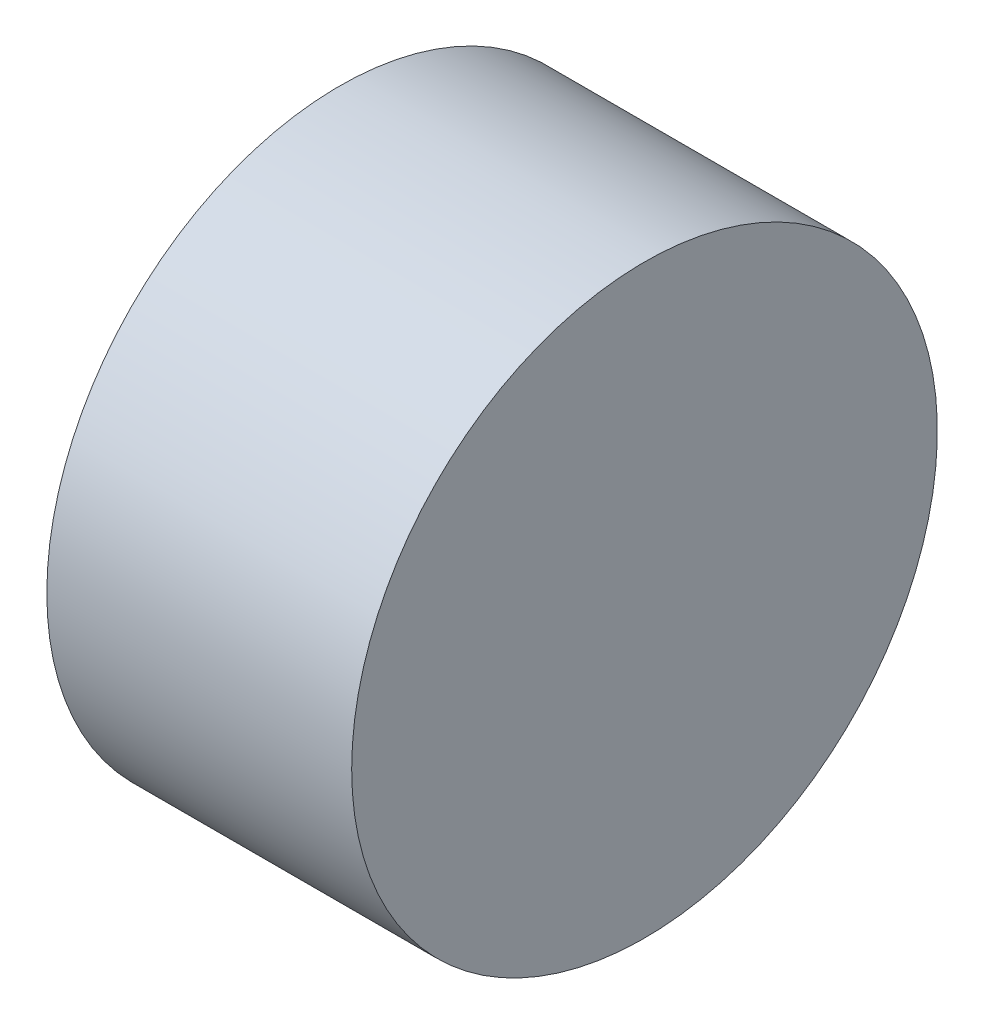
ISO-10303-21;
HEADER;
FILE_DESCRIPTION(('STEP AP214'),'2;1');
FILE_NAME('part.step','',(''),(''),'','','');
FILE_SCHEMA(('AUTOMOTIVE_DESIGN { 1 0 10303 214 1 1 1 1 }'));
ENDSEC;
DATA;
#1=APPLICATION_CONTEXT('core data for automotive mechanical design processes');
#2=APPLICATION_PROTOCOL_DEFINITION('international standard','automotive_design',2000,#1);
#3=PRODUCT_CONTEXT('',#1,'mechanical');
#4=PRODUCT('Part','Part','',(#3));
#5=PRODUCT_RELATED_PRODUCT_CATEGORY('part','',(#4));
#6=PRODUCT_DEFINITION_FORMATION('','',#4);
#7=PRODUCT_DEFINITION_CONTEXT('part definition',#1,'design');
#8=PRODUCT_DEFINITION('design','',#6,#7);
#9=PRODUCT_DEFINITION_SHAPE('','',#8);
#10=(LENGTH_UNIT() NAMED_UNIT(*) SI_UNIT(.MILLI.,.METRE.));
#11=(NAMED_UNIT(*) PLANE_ANGLE_UNIT() SI_UNIT($,.RADIAN.));
#12=(NAMED_UNIT(*) SI_UNIT($,.STERADIAN.) SOLID_ANGLE_UNIT());
#13=UNCERTAINTY_MEASURE_WITH_UNIT(LENGTH_MEASURE(1.E-05),#10,'distance_accuracy_value','');
#14=(GEOMETRIC_REPRESENTATION_CONTEXT(3) GLOBAL_UNCERTAINTY_ASSIGNED_CONTEXT((#13)) GLOBAL_UNIT_ASSIGNED_CONTEXT((#10,
#11,#12)) REPRESENTATION_CONTEXT('',''));
#15=CARTESIAN_POINT('',(0.,0.,0.));
#16=DIRECTION('',(0.,0.,1.));
#17=DIRECTION('',(1.,0.,0.));
#18=AXIS2_PLACEMENT_3D('',#15,#16,#17);
#19=CARTESIAN_POINT('',(0.,0.,-12.2000000000035));
#20=DIRECTION('',(-1.,0.,0.));
#21=DIRECTION('',(0.,0.,1.));
#22=AXIS2_PLACEMENT_3D('',#19,#20,#21);
#23=PLANE('',#22);
#24=CARTESIAN_POINT('',(0.,0.,0.));
#25=DIRECTION('',(-1.,0.,0.));
#26=DIRECTION('',(0.,0.,1.));
#27=AXIS2_PLACEMENT_3D('',#24,#25,#26);
#28=CIRCLE('',#27,12.2000000000035);
#29=CARTESIAN_POINT('',(0.,0.,12.2000000000035));
#30=VERTEX_POINT('',#29);
#31=EDGE_CURVE('E222',#30,#30,#28,.T.);
#32=ORIENTED_EDGE('',*,*,#31,.F.);
#33=EDGE_LOOP('',(#32));
#34=FACE_BOUND('',#33,.T.);
#35=ADVANCED_FACE('F36',(#34),#23,.F.);
#36=CARTESIAN_POINT('',(-16.7,0.,0.));
#37=DIRECTION('',(1.,0.,0.));
#38=DIRECTION('',(0.,0.,-1.));
#39=AXIS2_PLACEMENT_3D('',#36,#37,#38);
#40=PLANE('',#39);
#41=CARTESIAN_POINT('',(-16.7,0.,0.));
#42=DIRECTION('',(-1.,0.,0.));
#43=DIRECTION('',(0.,0.,1.));
#44=AXIS2_PLACEMENT_3D('',#41,#42,#43);
#45=CIRCLE('',#44,3.);
#46=CARTESIAN_POINT('',(-16.7,0.,3.));
#47=VERTEX_POINT('',#46);
#48=EDGE_CURVE('E11',#47,#47,#45,.T.);
#49=ORIENTED_EDGE('',*,*,#48,.T.);
#50=EDGE_LOOP('',(#49));
#51=FACE_BOUND('',#50,.T.);
#52=ADVANCED_FACE('F253',(#51),#40,.F.);
#53=CARTESIAN_POINT('',(-159.613189405079,0.,0.));
#54=DIRECTION('',(-1.,0.,0.));
#55=DIRECTION('',(0.,0.,1.));
#56=AXIS2_PLACEMENT_3D('',#53,#54,#55);
#57=CYLINDRICAL_SURFACE('',#56,3.);
#58=ORIENTED_EDGE('',*,*,#48,.F.);
#59=EDGE_LOOP('',(#58));
#60=FACE_BOUND('',#59,.T.);
#61=CARTESIAN_POINT('',(-12.7,0.,0.));
#62=DIRECTION('',(-1.,0.,0.));
#63=DIRECTION('',(0.,0.,1.));
#64=AXIS2_PLACEMENT_3D('',#61,#62,#63);
#65=CIRCLE('',#64,3.);
#66=CARTESIAN_POINT('',(-12.7,0.,3.));
#67=VERTEX_POINT('',#66);
#68=EDGE_CURVE('E43',#67,#67,#65,.T.);
#69=ORIENTED_EDGE('',*,*,#68,.T.);
#70=EDGE_LOOP('',(#69));
#71=FACE_BOUND('',#70,.T.);
#72=ADVANCED_FACE('F236',(#60,#71),#57,.T.);
#73=CARTESIAN_POINT('',(-12.7,0.,-3.));
#74=DIRECTION('',(1.,0.,0.));
#75=DIRECTION('',(0.,0.,-1.));
#76=AXIS2_PLACEMENT_3D('',#73,#74,#75);
#77=PLANE('',#76);
#78=CARTESIAN_POINT('',(-12.7,-5.0835038482262,0.));
#79=DIRECTION('',(-1.,0.,0.));
#80=DIRECTION('',(0.,0.,1.));
#81=AXIS2_PLACEMENT_3D('',#78,#79,#80);
#82=CIRCLE('',#81,0.65);
#83=CARTESIAN_POINT('',(-12.7,-5.0835038482262,0.649999999999983));
#84=VERTEX_POINT('',#83);
#85=EDGE_CURVE('E385',#84,#84,#82,.T.);
#86=ORIENTED_EDGE('',*,*,#85,.F.);
#87=EDGE_LOOP('',(#86));
#88=FACE_BOUND('',#87,.T.);
#89=CARTESIAN_POINT('',(-12.7,5.0835038482262,0.));
#90=DIRECTION('',(-1.,0.,0.));
#91=DIRECTION('',(0.,0.,1.));
#92=AXIS2_PLACEMENT_3D('',#89,#90,#91);
#93=CIRCLE('',#92,0.65);
#94=CARTESIAN_POINT('',(-12.7,5.0835038482262,0.649999999999982));
#95=VERTEX_POINT('',#94);
#96=EDGE_CURVE('E384',#95,#95,#93,.T.);
#97=ORIENTED_EDGE('',*,*,#96,.F.);
#98=EDGE_LOOP('',(#97));
#99=FACE_BOUND('',#98,.T.);
#100=CARTESIAN_POINT('',(-12.7,-7.57819435489836,-4.85499436862564));
#101=DIRECTION('',(-1.,0.,0.));
#102=DIRECTION('',(0.,0.,1.));
#103=AXIS2_PLACEMENT_3D('',#100,#101,#102);
#104=CIRCLE('',#103,0.75);
#105=CARTESIAN_POINT('',(-12.7,-7.57819435489836,-4.10499436862564));
#106=VERTEX_POINT('',#105);
#107=EDGE_CURVE('E394',#106,#106,#104,.T.);
#108=ORIENTED_EDGE('',*,*,#107,.F.);
#109=EDGE_LOOP('',(#108));
#110=FACE_BOUND('',#109,.T.);
#111=CARTESIAN_POINT('',(-12.7,-5.16494921499982,-3.30894117764878));
#112=DIRECTION('',(-1.,0.,0.));
#113=DIRECTION('',(0.,0.,1.));
#114=AXIS2_PLACEMENT_3D('',#111,#112,#113);
#115=CIRCLE('',#114,0.749999999999998);
#116=CARTESIAN_POINT('',(-12.7,-5.16494921499982,-2.55894117764878));
#117=VERTEX_POINT('',#116);
#118=EDGE_CURVE('E406',#117,#117,#115,.T.);
#119=ORIENTED_EDGE('',*,*,#118,.F.);
#120=EDGE_LOOP('',(#119));
#121=FACE_BOUND('',#120,.T.);
#122=CARTESIAN_POINT('',(-12.7,-0.415451281010973,8.99040601047063));
#123=DIRECTION('',(-1.,0.,0.));
#124=DIRECTION('',(0.,0.,1.));
#125=AXIS2_PLACEMENT_3D('',#122,#123,#124);
#126=CIRCLE('',#125,0.75);
#127=CARTESIAN_POINT('',(-12.7,-0.415451281010973,9.74040601047063));
#128=VERTEX_POINT('',#127);
#129=EDGE_CURVE('E400',#128,#128,#126,.T.);
#130=ORIENTED_EDGE('',*,*,#129,.F.);
#131=EDGE_LOOP('',(#130));
#132=FACE_BOUND('',#131,.T.);
#133=CARTESIAN_POINT('',(-12.7,-0.283152511972302,6.12744781827073));
#134=DIRECTION('',(-1.,0.,0.));
#135=DIRECTION('',(0.,0.,1.));
#136=AXIS2_PLACEMENT_3D('',#133,#134,#135);
#137=CIRCLE('',#136,0.75);
#138=CARTESIAN_POINT('',(-12.7,-0.283152511972302,6.87744781827073));
#139=VERTEX_POINT('',#138);
#140=EDGE_CURVE('E399',#139,#139,#137,.T.);
#141=ORIENTED_EDGE('',*,*,#140,.F.);
#142=EDGE_LOOP('',(#141));
#143=FACE_BOUND('',#142,.T.);
#144=CARTESIAN_POINT('',(-12.7,7.99364563590934,-4.13541164184506));
#145=DIRECTION('',(-1.,0.,0.));
#146=DIRECTION('',(0.,0.,1.));
#147=AXIS2_PLACEMENT_3D('',#144,#145,#146);
#148=CIRCLE('',#147,0.75);
#149=CARTESIAN_POINT('',(-12.7,7.99364563590934,-3.38541164184506));
#150=VERTEX_POINT('',#149);
#151=EDGE_CURVE('E417',#150,#150,#148,.T.);
#152=ORIENTED_EDGE('',*,*,#151,.F.);
#153=EDGE_LOOP('',(#152));
#154=FACE_BOUND('',#153,.T.);
#155=CARTESIAN_POINT('',(-12.7,5.44810172697213,-2.818506640622));
#156=DIRECTION('',(-1.,0.,0.));
#157=DIRECTION('',(0.,0.,1.));
#158=AXIS2_PLACEMENT_3D('',#155,#156,#157);
#159=CIRCLE('',#158,0.749999999999998);
#160=CARTESIAN_POINT('',(-12.7,5.44810172697213,-2.068506640622));
#161=VERTEX_POINT('',#160);
#162=EDGE_CURVE('E150',#161,#161,#159,.T.);
#163=ORIENTED_EDGE('',*,*,#162,.F.);
#164=EDGE_LOOP('',(#163));
#165=FACE_BOUND('',#164,.T.);
#166=CARTESIAN_POINT('',(-12.7,0.,0.));
#167=DIRECTION('',(-1.,0.,0.));
#168=DIRECTION('',(0.,0.,1.));
#169=AXIS2_PLACEMENT_3D('',#166,#167,#168);
#170=CIRCLE('',#169,11.);
#171=CARTESIAN_POINT('',(-12.7,7.69478931895491,7.86067537409461));
#172=VERTEX_POINT('',#171);
#173=CARTESIAN_POINT('',(-12.7,10.357432093874,3.70453781473321));
#174=VERTEX_POINT('',#173);
#175=EDGE_CURVE('E156',#172,#174,#170,.T.);
#176=ORIENTED_EDGE('',*,*,#175,.F.);
#177=CARTESIAN_POINT('',(-12.7,7.70986986942216,6.44654222018102));
#178=DIRECTION('',(-1.,0.,0.));
#179=DIRECTION('',(0.,0.,1.));
#180=AXIS2_PLACEMENT_3D('',#177,#178,#179);
#181=CIRCLE('',#180,1.41421356237309);
#182=CARTESIAN_POINT('',(-12.7,6.29573671550856,6.43146166971377));
#183=VERTEX_POINT('',#182);
#184=EDGE_CURVE('E50',#183,#172,#181,.T.);
#185=ORIENTED_EDGE('',*,*,#184,.F.);
#186=CARTESIAN_POINT('',(-12.7,0.,0.));
#187=DIRECTION('',(1.,0.,0.));
#188=DIRECTION('',(0.,0.,1.));
#189=AXIS2_PLACEMENT_3D('',#186,#187,#188);
#190=CIRCLE('',#189,9.);
#191=CARTESIAN_POINT('',(-12.7,8.47426262226057,3.03098548478172));
#192=VERTEX_POINT('',#191);
#193=EDGE_CURVE('E144',#192,#183,#190,.T.);
#194=ORIENTED_EDGE('',*,*,#193,.F.);
#195=CARTESIAN_POINT('',(-12.7,9.07907119309155,4.3093463855642));
#196=DIRECTION('',(-1.,0.,0.));
#197=DIRECTION('',(0.,0.,-1.));
#198=AXIS2_PLACEMENT_3D('',#195,#196,#197);
#199=CIRCLE('',#198,1.4142135623731);
#200=EDGE_CURVE('E147',#174,#192,#199,.T.);
#201=ORIENTED_EDGE('',*,*,#200,.F.);
#202=EDGE_LOOP('',(#176,#185,#194,#201));
#203=FACE_BOUND('',#202,.T.);
#204=CARTESIAN_POINT('',(-12.7,0.,0.));
#205=DIRECTION('',(-1.,0.,0.));
#206=DIRECTION('',(0.,0.,1.));
#207=AXIS2_PLACEMENT_3D('',#204,#205,#206);
#208=CIRCLE('',#207,11.);
#209=CARTESIAN_POINT('',(-12.7,-10.6549392243461,2.73354533993676));
#210=VERTEX_POINT('',#209);
#211=CARTESIAN_POINT('',(-12.7,-8.3869399037761,7.11753040390052));
#212=VERTEX_POINT('',#211);
#213=EDGE_CURVE('E182',#210,#212,#208,.T.);
#214=ORIENTED_EDGE('',*,*,#213,.F.);
#215=CARTESIAN_POINT('',(-12.7,-9.43780426395679,3.45367205670125));
#216=DIRECTION('',(-1.,0.,0.));
#217=DIRECTION('',(0.,0.,1.));
#218=AXIS2_PLACEMENT_3D('',#215,#216,#217);
#219=CIRCLE('',#218,1.4142135623731);
#220=CARTESIAN_POINT('',(-12.7,-8.7176775471923,2.2365370963119));
#221=VERTEX_POINT('',#220);
#222=EDGE_CURVE('E58',#221,#210,#219,.T.);
#223=ORIENTED_EDGE('',*,*,#222,.F.);
#224=CARTESIAN_POINT('',(-12.7,0.,0.));
#225=DIRECTION('',(1.,0.,0.));
#226=DIRECTION('',(0.,0.,1.));
#227=AXIS2_PLACEMENT_3D('',#224,#225,#226);
#228=CIRCLE('',#227,9.);
#229=CARTESIAN_POINT('',(-12.7,-6.86204173945317,5.82343396682769));
#230=VERTEX_POINT('',#229);
#231=EDGE_CURVE('E171',#230,#221,#228,.T.);
#232=ORIENTED_EDGE('',*,*,#231,.F.);
#233=CARTESIAN_POINT('',(-12.7,-8.27153904015104,5.70803310320264));
#234=DIRECTION('',(-1.,0.,0.));
#235=DIRECTION('',(0.,0.,-1.));
#236=AXIS2_PLACEMENT_3D('',#233,#234,#235);
#237=CIRCLE('',#236,1.4142135623731);
#238=EDGE_CURVE('E186',#212,#230,#237,.T.);
#239=ORIENTED_EDGE('',*,*,#238,.F.);
#240=EDGE_LOOP('',(#214,#223,#232,#239));
#241=FACE_BOUND('',#240,.T.);
#242=CARTESIAN_POINT('',(-12.7,0.,0.));
#243=DIRECTION('',(-1.,0.,0.));
#244=DIRECTION('',(0.,0.,1.));
#245=AXIS2_PLACEMENT_3D('',#242,#243,#244);
#246=CIRCLE('',#245,11.);
#247=CARTESIAN_POINT('',(-12.7,2.96014990539117,-10.5942207140314));
#248=VERTEX_POINT('',#247);
#249=CARTESIAN_POINT('',(-12.7,-1.97049219009802,-10.8220682186338));
#250=VERTEX_POINT('',#249);
#251=EDGE_CURVE('E212',#248,#250,#246,.T.);
#252=ORIENTED_EDGE('',*,*,#251,.F.);
#253=CARTESIAN_POINT('',(-12.7,1.72793439453457,-9.90021427688231));
#254=DIRECTION('',(-1.,0.,0.));
#255=DIRECTION('',(0.,0.,1.));
#256=AXIS2_PLACEMENT_3D('',#253,#254,#255);
#257=CIRCLE('',#256,1.41421356237309);
#258=CARTESIAN_POINT('',(-12.7,2.42194083168369,-8.66799876602571));
#259=VERTEX_POINT('',#258);
#260=EDGE_CURVE('E163',#259,#248,#257,.T.);
#261=ORIENTED_EDGE('',*,*,#260,.F.);
#262=CARTESIAN_POINT('',(-12.7,0.,0.));
#263=DIRECTION('',(1.,0.,0.));
#264=DIRECTION('',(0.,0.,1.));
#265=AXIS2_PLACEMENT_3D('',#262,#263,#264);
#266=CIRCLE('',#265,9.);
#267=CARTESIAN_POINT('',(-12.7,-1.61222088280747,-8.85441945160943));
#268=VERTEX_POINT('',#267);
#269=EDGE_CURVE('E201',#268,#259,#266,.T.);
#270=ORIENTED_EDGE('',*,*,#269,.F.);
#271=CARTESIAN_POINT('',(-12.7,-0.807532152940578,-10.0173794887669));
#272=DIRECTION('',(-1.,0.,0.));
#273=DIRECTION('',(0.,0.,-1.));
#274=AXIS2_PLACEMENT_3D('',#271,#272,#273);
#275=CIRCLE('',#274,1.4142135623731);
#276=EDGE_CURVE('E215',#250,#268,#275,.T.);
#277=ORIENTED_EDGE('',*,*,#276,.F.);
#278=EDGE_LOOP('',(#252,#261,#270,#277));
#279=FACE_BOUND('',#278,.T.);
#280=ORIENTED_EDGE('',*,*,#68,.F.);
#281=EDGE_LOOP('',(#280));
#282=FACE_BOUND('',#281,.T.);
#283=CARTESIAN_POINT('',(-12.7,0.,0.));
#284=DIRECTION('',(-1.,0.,0.));
#285=DIRECTION('',(0.,0.,1.));
#286=AXIS2_PLACEMENT_3D('',#283,#284,#285);
#287=CIRCLE('',#286,12.2);
#288=CARTESIAN_POINT('',(-12.7,0.,12.2));
#289=VERTEX_POINT('',#288);
#290=EDGE_CURVE('E231',#289,#289,#287,.T.);
#291=ORIENTED_EDGE('',*,*,#290,.T.);
#292=EDGE_LOOP('',(#291));
#293=FACE_BOUND('',#292,.T.);
#294=ADVANCED_FACE('F238',(#88,#99,#110,#121,#132,#143,#154,#165,#203,#241,#279,#282,#293),#77,.F.);
#295=CARTESIAN_POINT('',(-159.613189405079,0.,0.));
#296=DIRECTION('',(-1.,0.,0.));
#297=DIRECTION('',(0.,0.,1.));
#298=AXIS2_PLACEMENT_3D('',#295,#296,#297);
#299=CYLINDRICAL_SURFACE('',#298,12.2000000000018);
#300=ORIENTED_EDGE('',*,*,#290,.F.);
#301=EDGE_LOOP('',(#300));
#302=FACE_BOUND('',#301,.T.);
#303=ORIENTED_EDGE('',*,*,#31,.T.);
#304=EDGE_LOOP('',(#303));
#305=FACE_BOUND('',#304,.T.);
#306=ADVANCED_FACE('F241',(#302,#305),#299,.T.);
#307=CARTESIAN_POINT('',(-9.7,1.72793439453457,-9.90021427688231));
#308=DIRECTION('',(-1.,0.,0.));
#309=DIRECTION('',(0.,0.,1.));
#310=AXIS2_PLACEMENT_3D('',#307,#308,#309);
#311=CYLINDRICAL_SURFACE('',#310,1.41421356237309);
#312=ORIENTED_EDGE('',*,*,#260,.T.);
#313=DIRECTION('',(-1.,0.,0.));
#314=VECTOR('',#313,1.);
#315=CARTESIAN_POINT('',(-9.7,2.96014990539117,-10.5942207140314));
#316=LINE('',#315,#314);
#317=CARTESIAN_POINT('',(-9.7,2.96014990539117,-10.5942207140314));
#318=VERTEX_POINT('',#317);
#319=EDGE_CURVE('E210',#318,#248,#316,.T.);
#320=ORIENTED_EDGE('',*,*,#319,.F.);
#321=CARTESIAN_POINT('',(-9.7,1.72793439453457,-9.90021427688231));
#322=DIRECTION('',(-1.,0.,0.));
#323=DIRECTION('',(0.,0.,1.));
#324=AXIS2_PLACEMENT_3D('',#321,#322,#323);
#325=CIRCLE('',#324,1.41421356237309);
#326=CARTESIAN_POINT('',(-9.7,2.42194083168369,-8.66799876602571));
#327=VERTEX_POINT('',#326);
#328=EDGE_CURVE('E197',#327,#318,#325,.T.);
#329=ORIENTED_EDGE('',*,*,#328,.F.);
#330=DIRECTION('',(-1.,0.,0.));
#331=VECTOR('',#330,1.);
#332=CARTESIAN_POINT('',(-9.7,2.42194083168369,-8.66799876602571));
#333=LINE('',#332,#331);
#334=EDGE_CURVE('E220',#327,#259,#333,.T.);
#335=ORIENTED_EDGE('',*,*,#334,.T.);
#336=EDGE_LOOP('',(#312,#320,#329,#335));
#337=FACE_BOUND('',#336,.T.);
#338=ADVANCED_FACE('F248',(#337),#311,.F.);
#339=CARTESIAN_POINT('',(-9.7,0.,0.));
#340=DIRECTION('',(-1.,0.,0.));
#341=DIRECTION('',(0.,0.,1.));
#342=AXIS2_PLACEMENT_3D('',#339,#340,#341);
#343=CYLINDRICAL_SURFACE('',#342,9.);
#344=ORIENTED_EDGE('',*,*,#269,.T.);
#345=ORIENTED_EDGE('',*,*,#334,.F.);
#346=CARTESIAN_POINT('',(-9.7,0.,0.));
#347=DIRECTION('',(1.,0.,0.));
#348=DIRECTION('',(0.,0.,1.));
#349=AXIS2_PLACEMENT_3D('',#346,#347,#348);
#350=CIRCLE('',#349,9.);
#351=CARTESIAN_POINT('',(-9.7,-1.61222088280747,-8.85441945160943));
#352=VERTEX_POINT('',#351);
#353=EDGE_CURVE('E207',#352,#327,#350,.T.);
#354=ORIENTED_EDGE('',*,*,#353,.F.);
#355=DIRECTION('',(-1.,0.,0.));
#356=VECTOR('',#355,1.);
#357=CARTESIAN_POINT('',(-9.7,-1.61222088280747,-8.85441945160943));
#358=LINE('',#357,#356);
#359=EDGE_CURVE('E223',#352,#268,#358,.T.);
#360=ORIENTED_EDGE('',*,*,#359,.T.);
#361=EDGE_LOOP('',(#344,#345,#354,#360));
#362=FACE_BOUND('',#361,.T.);
#363=ADVANCED_FACE('F266',(#362),#343,.T.);
#364=CARTESIAN_POINT('',(-9.7,-0.807532152940578,-10.0173794887669));
#365=DIRECTION('',(-1.,0.,0.));
#366=DIRECTION('',(0.,0.,1.));
#367=AXIS2_PLACEMENT_3D('',#364,#365,#366);
#368=CYLINDRICAL_SURFACE('',#367,1.4142135623731);
#369=ORIENTED_EDGE('',*,*,#276,.T.);
#370=ORIENTED_EDGE('',*,*,#359,.F.);
#371=CARTESIAN_POINT('',(-9.7,-0.807532152940578,-10.0173794887669));
#372=DIRECTION('',(-1.,0.,0.));
#373=DIRECTION('',(0.,0.,-1.));
#374=AXIS2_PLACEMENT_3D('',#371,#372,#373);
#375=CIRCLE('',#374,1.4142135623731);
#376=CARTESIAN_POINT('',(-9.7,-1.97049219009802,-10.8220682186338));
#377=VERTEX_POINT('',#376);
#378=EDGE_CURVE('E204',#377,#352,#375,.T.);
#379=ORIENTED_EDGE('',*,*,#378,.F.);
#380=DIRECTION('',(-1.,0.,0.));
#381=VECTOR('',#380,1.);
#382=CARTESIAN_POINT('',(-9.7,-1.97049219009802,-10.8220682186338));
#383=LINE('',#382,#381);
#384=EDGE_CURVE('E225',#377,#250,#383,.T.);
#385=ORIENTED_EDGE('',*,*,#384,.T.);
#386=EDGE_LOOP('',(#369,#370,#379,#385));
#387=FACE_BOUND('',#386,.T.);
#388=ADVANCED_FACE('F272',(#387),#368,.F.);
#389=CARTESIAN_POINT('',(-9.7,0.,0.));
#390=DIRECTION('',(-1.,0.,0.));
#391=DIRECTION('',(0.,0.,1.));
#392=AXIS2_PLACEMENT_3D('',#389,#390,#391);
#393=CYLINDRICAL_SURFACE('',#392,11.);
#394=ORIENTED_EDGE('',*,*,#251,.T.);
#395=ORIENTED_EDGE('',*,*,#384,.F.);
#396=CARTESIAN_POINT('',(-9.7,0.,0.));
#397=DIRECTION('',(-1.,0.,0.));
#398=DIRECTION('',(0.,0.,1.));
#399=AXIS2_PLACEMENT_3D('',#396,#397,#398);
#400=CIRCLE('',#399,11.);
#401=EDGE_CURVE('E200',#318,#377,#400,.T.);
#402=ORIENTED_EDGE('',*,*,#401,.F.);
#403=ORIENTED_EDGE('',*,*,#319,.T.);
#404=EDGE_LOOP('',(#394,#395,#402,#403));
#405=FACE_BOUND('',#404,.T.);
#406=ADVANCED_FACE('F268',(#405),#393,.F.);
#407=CARTESIAN_POINT('',(-9.7,0.863967197267286,-4.95010713844116));
#408=DIRECTION('',(-1.,0.,0.));
#409=DIRECTION('',(0.,0.,1.));
#410=AXIS2_PLACEMENT_3D('',#407,#408,#409);
#411=PLANE('',#410);
#412=ORIENTED_EDGE('',*,*,#328,.T.);
#413=ORIENTED_EDGE('',*,*,#401,.T.);
#414=ORIENTED_EDGE('',*,*,#378,.T.);
#415=ORIENTED_EDGE('',*,*,#353,.T.);
#416=EDGE_LOOP('',(#412,#413,#414,#415));
#417=FACE_BOUND('',#416,.T.);
#418=ADVANCED_FACE('F271',(#417),#411,.T.);
#419=CARTESIAN_POINT('',(-9.7,-9.43780426395679,3.45367205670125));
#420=DIRECTION('',(-1.,0.,0.));
#421=DIRECTION('',(0.,0.,1.));
#422=AXIS2_PLACEMENT_3D('',#419,#420,#421);
#423=CYLINDRICAL_SURFACE('',#422,1.4142135623731);
#424=ORIENTED_EDGE('',*,*,#222,.T.);
#425=DIRECTION('',(-1.,0.,0.));
#426=VECTOR('',#425,1.);
#427=CARTESIAN_POINT('',(-9.7,-10.6549392243461,2.73354533993676));
#428=LINE('',#427,#426);
#429=CARTESIAN_POINT('',(-9.7,-10.6549392243461,2.73354533993676));
#430=VERTEX_POINT('',#429);
#431=EDGE_CURVE('E180',#430,#210,#428,.T.);
#432=ORIENTED_EDGE('',*,*,#431,.F.);
#433=CARTESIAN_POINT('',(-9.7,-9.43780426395679,3.45367205670125));
#434=DIRECTION('',(-1.,0.,0.));
#435=DIRECTION('',(0.,0.,1.));
#436=AXIS2_PLACEMENT_3D('',#433,#434,#435);
#437=CIRCLE('',#436,1.4142135623731);
#438=CARTESIAN_POINT('',(-9.7,-8.7176775471923,2.2365370963119));
#439=VERTEX_POINT('',#438);
#440=EDGE_CURVE('E167',#439,#430,#437,.T.);
#441=ORIENTED_EDGE('',*,*,#440,.F.);
#442=DIRECTION('',(-1.,0.,0.));
#443=VECTOR('',#442,1.);
#444=CARTESIAN_POINT('',(-9.7,-8.7176775471923,2.2365370963119));
#445=LINE('',#444,#443);
#446=EDGE_CURVE('E157',#439,#221,#445,.T.);
#447=ORIENTED_EDGE('',*,*,#446,.T.);
#448=EDGE_LOOP('',(#424,#432,#441,#447));
#449=FACE_BOUND('',#448,.T.);
#450=ADVANCED_FACE('F282',(#449),#423,.F.);
#451=CARTESIAN_POINT('',(-9.7,0.,0.));
#452=DIRECTION('',(-1.,0.,0.));
#453=DIRECTION('',(0.,0.,1.));
#454=AXIS2_PLACEMENT_3D('',#451,#452,#453);
#455=CYLINDRICAL_SURFACE('',#454,9.);
#456=ORIENTED_EDGE('',*,*,#231,.T.);
#457=ORIENTED_EDGE('',*,*,#446,.F.);
#458=CARTESIAN_POINT('',(-9.7,0.,0.));
#459=DIRECTION('',(1.,0.,0.));
#460=DIRECTION('',(0.,0.,1.));
#461=AXIS2_PLACEMENT_3D('',#458,#459,#460);
#462=CIRCLE('',#461,9.);
#463=CARTESIAN_POINT('',(-9.7,-6.86204173945317,5.82343396682769));
#464=VERTEX_POINT('',#463);
#465=EDGE_CURVE('E177',#464,#439,#462,.T.);
#466=ORIENTED_EDGE('',*,*,#465,.F.);
#467=DIRECTION('',(-1.,0.,0.));
#468=VECTOR('',#467,1.);
#469=CARTESIAN_POINT('',(-9.7,-6.86204173945317,5.82343396682769));
#470=LINE('',#469,#468);
#471=EDGE_CURVE('E192',#464,#230,#470,.T.);
#472=ORIENTED_EDGE('',*,*,#471,.T.);
#473=EDGE_LOOP('',(#456,#457,#466,#472));
#474=FACE_BOUND('',#473,.T.);
#475=ADVANCED_FACE('F286',(#474),#455,.T.);
#476=CARTESIAN_POINT('',(-9.7,-8.27153904015104,5.70803310320264));
#477=DIRECTION('',(-1.,0.,0.));
#478=DIRECTION('',(0.,0.,1.));
#479=AXIS2_PLACEMENT_3D('',#476,#477,#478);
#480=CYLINDRICAL_SURFACE('',#479,1.4142135623731);
#481=ORIENTED_EDGE('',*,*,#238,.T.);
#482=ORIENTED_EDGE('',*,*,#471,.F.);
#483=CARTESIAN_POINT('',(-9.7,-8.27153904015104,5.70803310320264));
#484=DIRECTION('',(-1.,0.,0.));
#485=DIRECTION('',(0.,0.,-1.));
#486=AXIS2_PLACEMENT_3D('',#483,#484,#485);
#487=CIRCLE('',#486,1.4142135623731);
#488=CARTESIAN_POINT('',(-9.7,-8.3869399037761,7.11753040390052));
#489=VERTEX_POINT('',#488);
#490=EDGE_CURVE('E174',#489,#464,#487,.T.);
#491=ORIENTED_EDGE('',*,*,#490,.F.);
#492=DIRECTION('',(-1.,0.,0.));
#493=VECTOR('',#492,1.);
#494=CARTESIAN_POINT('',(-9.7,-8.3869399037761,7.11753040390052));
#495=LINE('',#494,#493);
#496=EDGE_CURVE('E194',#489,#212,#495,.T.);
#497=ORIENTED_EDGE('',*,*,#496,.T.);
#498=EDGE_LOOP('',(#481,#482,#491,#497));
#499=FACE_BOUND('',#498,.T.);
#500=ADVANCED_FACE('F291',(#499),#480,.F.);
#501=CARTESIAN_POINT('',(-9.7,0.,0.));
#502=DIRECTION('',(-1.,0.,0.));
#503=DIRECTION('',(0.,0.,1.));
#504=AXIS2_PLACEMENT_3D('',#501,#502,#503);
#505=CYLINDRICAL_SURFACE('',#504,11.);
#506=ORIENTED_EDGE('',*,*,#213,.T.);
#507=ORIENTED_EDGE('',*,*,#496,.F.);
#508=CARTESIAN_POINT('',(-9.7,0.,0.));
#509=DIRECTION('',(-1.,0.,0.));
#510=DIRECTION('',(0.,0.,1.));
#511=AXIS2_PLACEMENT_3D('',#508,#509,#510);
#512=CIRCLE('',#511,11.);
#513=EDGE_CURVE('E170',#430,#489,#512,.T.);
#514=ORIENTED_EDGE('',*,*,#513,.F.);
#515=ORIENTED_EDGE('',*,*,#431,.T.);
#516=EDGE_LOOP('',(#506,#507,#514,#515));
#517=FACE_BOUND('',#516,.T.);
#518=ADVANCED_FACE('F287',(#517),#505,.F.);
#519=CARTESIAN_POINT('',(-9.7,-4.71890213197839,1.72683602835062));
#520=DIRECTION('',(-1.,0.,0.));
#521=DIRECTION('',(0.,0.,1.));
#522=AXIS2_PLACEMENT_3D('',#519,#520,#521);
#523=PLANE('',#522);
#524=ORIENTED_EDGE('',*,*,#440,.T.);
#525=ORIENTED_EDGE('',*,*,#513,.T.);
#526=ORIENTED_EDGE('',*,*,#490,.T.);
#527=ORIENTED_EDGE('',*,*,#465,.T.);
#528=EDGE_LOOP('',(#524,#525,#526,#527));
#529=FACE_BOUND('',#528,.T.);
#530=ADVANCED_FACE('F290',(#529),#523,.T.);
#531=CARTESIAN_POINT('',(-9.7,7.70986986942216,6.44654222018102));
#532=DIRECTION('',(-1.,0.,0.));
#533=DIRECTION('',(0.,0.,1.));
#534=AXIS2_PLACEMENT_3D('',#531,#532,#533);
#535=CYLINDRICAL_SURFACE('',#534,1.41421356237309);
#536=ORIENTED_EDGE('',*,*,#184,.T.);
#537=DIRECTION('',(-1.,0.,0.));
#538=VECTOR('',#537,1.);
#539=CARTESIAN_POINT('',(-9.7,7.69478931895491,7.86067537409461));
#540=LINE('',#539,#538);
#541=CARTESIAN_POINT('',(-9.7,7.69478931895491,7.86067537409461));
#542=VERTEX_POINT('',#541);
#543=EDGE_CURVE('E122',#542,#172,#540,.T.);
#544=ORIENTED_EDGE('',*,*,#543,.F.);
#545=CARTESIAN_POINT('',(-9.7,7.70986986942216,6.44654222018102));
#546=DIRECTION('',(-1.,0.,0.));
#547=DIRECTION('',(0.,0.,1.));
#548=AXIS2_PLACEMENT_3D('',#545,#546,#547);
#549=CIRCLE('',#548,1.41421356237309);
#550=CARTESIAN_POINT('',(-9.7,6.29573671550856,6.43146166971377));
#551=VERTEX_POINT('',#550);
#552=EDGE_CURVE('E126',#551,#542,#549,.T.);
#553=ORIENTED_EDGE('',*,*,#552,.F.);
#554=DIRECTION('',(-1.,0.,0.));
#555=VECTOR('',#554,1.);
#556=CARTESIAN_POINT('',(-9.7,6.29573671550856,6.43146166971377));
#557=LINE('',#556,#555);
#558=EDGE_CURVE('E161',#551,#183,#557,.T.);
#559=ORIENTED_EDGE('',*,*,#558,.T.);
#560=EDGE_LOOP('',(#536,#544,#553,#559));
#561=FACE_BOUND('',#560,.T.);
#562=ADVANCED_FACE('F124',(#561),#535,.F.);
#563=CARTESIAN_POINT('',(-9.7,0.,0.));
#564=DIRECTION('',(-1.,0.,0.));
#565=DIRECTION('',(0.,0.,1.));
#566=AXIS2_PLACEMENT_3D('',#563,#564,#565);
#567=CYLINDRICAL_SURFACE('',#566,9.);
#568=ORIENTED_EDGE('',*,*,#193,.T.);
#569=ORIENTED_EDGE('',*,*,#558,.F.);
#570=CARTESIAN_POINT('',(-9.7,0.,0.));
#571=DIRECTION('',(1.,0.,0.));
#572=DIRECTION('',(0.,0.,1.));
#573=AXIS2_PLACEMENT_3D('',#570,#571,#572);
#574=CIRCLE('',#573,9.);
#575=CARTESIAN_POINT('',(-9.7,8.47426262226057,3.03098548478172));
#576=VERTEX_POINT('',#575);
#577=EDGE_CURVE('E132',#576,#551,#574,.T.);
#578=ORIENTED_EDGE('',*,*,#577,.F.);
#579=DIRECTION('',(-1.,0.,0.));
#580=VECTOR('',#579,1.);
#581=CARTESIAN_POINT('',(-9.7,8.47426262226057,3.03098548478172));
#582=LINE('',#581,#580);
#583=EDGE_CURVE('E164',#576,#192,#582,.T.);
#584=ORIENTED_EDGE('',*,*,#583,.T.);
#585=EDGE_LOOP('',(#568,#569,#578,#584));
#586=FACE_BOUND('',#585,.T.);
#587=ADVANCED_FACE('F304',(#586),#567,.T.);
#588=CARTESIAN_POINT('',(-9.7,9.07907119309155,4.3093463855642));
#589=DIRECTION('',(-1.,0.,0.));
#590=DIRECTION('',(0.,0.,1.));
#591=AXIS2_PLACEMENT_3D('',#588,#589,#590);
#592=CYLINDRICAL_SURFACE('',#591,1.4142135623731);
#593=ORIENTED_EDGE('',*,*,#200,.T.);
#594=ORIENTED_EDGE('',*,*,#583,.F.);
#595=CARTESIAN_POINT('',(-9.7,9.07907119309155,4.3093463855642));
#596=DIRECTION('',(-1.,0.,0.));
#597=DIRECTION('',(0.,0.,-1.));
#598=AXIS2_PLACEMENT_3D('',#595,#596,#597);
#599=CIRCLE('',#598,1.4142135623731);
#600=CARTESIAN_POINT('',(-9.7,10.357432093874,3.70453781473321));
#601=VERTEX_POINT('',#600);
#602=EDGE_CURVE('E140',#601,#576,#599,.T.);
#603=ORIENTED_EDGE('',*,*,#602,.F.);
#604=DIRECTION('',(-1.,0.,0.));
#605=VECTOR('',#604,1.);
#606=CARTESIAN_POINT('',(-9.7,10.357432093874,3.70453781473321));
#607=LINE('',#606,#605);
#608=EDGE_CURVE('E131',#601,#174,#607,.T.);
#609=ORIENTED_EDGE('',*,*,#608,.T.);
#610=EDGE_LOOP('',(#593,#594,#603,#609));
#611=FACE_BOUND('',#610,.T.);
#612=ADVANCED_FACE('F307',(#611),#592,.F.);
#613=CARTESIAN_POINT('',(-9.7,0.,0.));
#614=DIRECTION('',(-1.,0.,0.));
#615=DIRECTION('',(0.,0.,1.));
#616=AXIS2_PLACEMENT_3D('',#613,#614,#615);
#617=CYLINDRICAL_SURFACE('',#616,11.);
#618=ORIENTED_EDGE('',*,*,#175,.T.);
#619=ORIENTED_EDGE('',*,*,#608,.F.);
#620=CARTESIAN_POINT('',(-9.7,0.,0.));
#621=DIRECTION('',(-1.,0.,0.));
#622=DIRECTION('',(0.,0.,1.));
#623=AXIS2_PLACEMENT_3D('',#620,#621,#622);
#624=CIRCLE('',#623,11.);
#625=EDGE_CURVE('E135',#542,#601,#624,.T.);
#626=ORIENTED_EDGE('',*,*,#625,.F.);
#627=ORIENTED_EDGE('',*,*,#543,.T.);
#628=EDGE_LOOP('',(#618,#619,#626,#627));
#629=FACE_BOUND('',#628,.T.);
#630=ADVANCED_FACE('F136',(#629),#617,.F.);
#631=CARTESIAN_POINT('',(-9.7,3.85493493471108,3.22327111009051));
#632=DIRECTION('',(-1.,0.,0.));
#633=DIRECTION('',(0.,0.,1.));
#634=AXIS2_PLACEMENT_3D('',#631,#632,#633);
#635=PLANE('',#634);
#636=ORIENTED_EDGE('',*,*,#552,.T.);
#637=ORIENTED_EDGE('',*,*,#625,.T.);
#638=ORIENTED_EDGE('',*,*,#602,.T.);
#639=ORIENTED_EDGE('',*,*,#577,.T.);
#640=EDGE_LOOP('',(#636,#637,#638,#639));
#641=FACE_BOUND('',#640,.T.);
#642=ADVANCED_FACE('F142',(#641),#635,.T.);
#643=CARTESIAN_POINT('',(-9.7,5.44810172697213,-2.818506640622));
#644=DIRECTION('',(-1.,0.,0.));
#645=DIRECTION('',(0.,0.,1.));
#646=AXIS2_PLACEMENT_3D('',#643,#644,#645);
#647=CYLINDRICAL_SURFACE('',#646,0.749999999999998);
#648=CARTESIAN_POINT('',(-9.7,5.44810172697213,-2.818506640622));
#649=DIRECTION('',(-1.,0.,0.));
#650=DIRECTION('',(0.,0.,1.));
#651=AXIS2_PLACEMENT_3D('',#648,#649,#650);
#652=CIRCLE('',#651,0.749999999999998);
#653=CARTESIAN_POINT('',(-9.7,5.44810172697213,-2.068506640622));
#654=VERTEX_POINT('',#653);
#655=EDGE_CURVE('E183',#654,#654,#652,.T.);
#656=ORIENTED_EDGE('',*,*,#655,.F.);
#657=EDGE_LOOP('',(#656));
#658=FACE_BOUND('',#657,.T.);
#659=ORIENTED_EDGE('',*,*,#162,.T.);
#660=EDGE_LOOP('',(#659));
#661=FACE_BOUND('',#660,.T.);
#662=ADVANCED_FACE('F316',(#658,#661),#647,.F.);
#663=CARTESIAN_POINT('',(-9.7,5.44810172697213,-2.818506640622));
#664=DIRECTION('',(-1.,0.,0.));
#665=DIRECTION('',(0.,0.,1.));
#666=AXIS2_PLACEMENT_3D('',#663,#664,#665);
#667=PLANE('',#666);
#668=ORIENTED_EDGE('',*,*,#655,.T.);
#669=EDGE_LOOP('',(#668));
#670=FACE_BOUND('',#669,.T.);
#671=ADVANCED_FACE('F319',(#670),#667,.T.);
#672=CARTESIAN_POINT('',(-9.7,7.99364563590934,-4.13541164184506));
#673=DIRECTION('',(-1.,0.,0.));
#674=DIRECTION('',(0.,0.,1.));
#675=AXIS2_PLACEMENT_3D('',#672,#673,#674);
#676=CYLINDRICAL_SURFACE('',#675,0.75);
#677=CARTESIAN_POINT('',(-9.7,7.99364563590934,-4.13541164184506));
#678=DIRECTION('',(-1.,0.,0.));
#679=DIRECTION('',(0.,0.,1.));
#680=AXIS2_PLACEMENT_3D('',#677,#678,#679);
#681=CIRCLE('',#680,0.75);
#682=CARTESIAN_POINT('',(-9.7,7.99364563590934,-3.38541164184506));
#683=VERTEX_POINT('',#682);
#684=EDGE_CURVE('E414',#683,#683,#681,.T.);
#685=ORIENTED_EDGE('',*,*,#684,.F.);
#686=EDGE_LOOP('',(#685));
#687=FACE_BOUND('',#686,.T.);
#688=ORIENTED_EDGE('',*,*,#151,.T.);
#689=EDGE_LOOP('',(#688));
#690=FACE_BOUND('',#689,.T.);
#691=ADVANCED_FACE('F323',(#687,#690),#676,.F.);
#692=CARTESIAN_POINT('',(-9.7,7.99364563590934,-4.13541164184506));
#693=DIRECTION('',(-1.,0.,0.));
#694=DIRECTION('',(0.,0.,1.));
#695=AXIS2_PLACEMENT_3D('',#692,#693,#694);
#696=PLANE('',#695);
#697=ORIENTED_EDGE('',*,*,#684,.T.);
#698=EDGE_LOOP('',(#697));
#699=FACE_BOUND('',#698,.T.);
#700=ADVANCED_FACE('F329',(#699),#696,.T.);
#701=CARTESIAN_POINT('',(-9.7,-0.283152511972302,6.12744781827073));
#702=DIRECTION('',(-1.,0.,0.));
#703=DIRECTION('',(0.,0.,1.));
#704=AXIS2_PLACEMENT_3D('',#701,#702,#703);
#705=CYLINDRICAL_SURFACE('',#704,0.75);
#706=CARTESIAN_POINT('',(-9.7,-0.283152511972302,6.12744781827073));
#707=DIRECTION('',(-1.,0.,0.));
#708=DIRECTION('',(0.,0.,1.));
#709=AXIS2_PLACEMENT_3D('',#706,#707,#708);
#710=CIRCLE('',#709,0.75);
#711=CARTESIAN_POINT('',(-9.7,-0.283152511972302,6.87744781827073));
#712=VERTEX_POINT('',#711);
#713=EDGE_CURVE('E420',#712,#712,#710,.T.);
#714=ORIENTED_EDGE('',*,*,#713,.F.);
#715=EDGE_LOOP('',(#714));
#716=FACE_BOUND('',#715,.T.);
#717=ORIENTED_EDGE('',*,*,#140,.T.);
#718=EDGE_LOOP('',(#717));
#719=FACE_BOUND('',#718,.T.);
#720=ADVANCED_FACE('F325',(#716,#719),#705,.F.);
#721=CARTESIAN_POINT('',(-9.7,-0.283152511972302,6.12744781827073));
#722=DIRECTION('',(-1.,0.,0.));
#723=DIRECTION('',(0.,0.,1.));
#724=AXIS2_PLACEMENT_3D('',#721,#722,#723);
#725=PLANE('',#724);
#726=ORIENTED_EDGE('',*,*,#713,.T.);
#727=EDGE_LOOP('',(#726));
#728=FACE_BOUND('',#727,.T.);
#729=ADVANCED_FACE('F328',(#728),#725,.T.);
#730=CARTESIAN_POINT('',(-9.7,-0.415451281010973,8.99040601047063));
#731=DIRECTION('',(-1.,0.,0.));
#732=DIRECTION('',(0.,0.,1.));
#733=AXIS2_PLACEMENT_3D('',#730,#731,#732);
#734=CYLINDRICAL_SURFACE('',#733,0.75);
#735=CARTESIAN_POINT('',(-9.7,-0.415451281010973,8.99040601047063));
#736=DIRECTION('',(-1.,0.,0.));
#737=DIRECTION('',(0.,0.,1.));
#738=AXIS2_PLACEMENT_3D('',#735,#736,#737);
#739=CIRCLE('',#738,0.75);
#740=CARTESIAN_POINT('',(-9.7,-0.415451281010973,9.74040601047063));
#741=VERTEX_POINT('',#740);
#742=EDGE_CURVE('E396',#741,#741,#739,.T.);
#743=ORIENTED_EDGE('',*,*,#742,.F.);
#744=EDGE_LOOP('',(#743));
#745=FACE_BOUND('',#744,.T.);
#746=ORIENTED_EDGE('',*,*,#129,.T.);
#747=EDGE_LOOP('',(#746));
#748=FACE_BOUND('',#747,.T.);
#749=ADVANCED_FACE('F333',(#745,#748),#734,.F.);
#750=CARTESIAN_POINT('',(-9.7,-0.415451281010973,8.99040601047063));
#751=DIRECTION('',(-1.,0.,0.));
#752=DIRECTION('',(0.,0.,1.));
#753=AXIS2_PLACEMENT_3D('',#750,#751,#752);
#754=PLANE('',#753);
#755=ORIENTED_EDGE('',*,*,#742,.T.);
#756=EDGE_LOOP('',(#755));
#757=FACE_BOUND('',#756,.T.);
#758=ADVANCED_FACE('F354',(#757),#754,.T.);
#759=CARTESIAN_POINT('',(-9.7,-5.16494921499982,-3.30894117764878));
#760=DIRECTION('',(-1.,0.,0.));
#761=DIRECTION('',(0.,0.,1.));
#762=AXIS2_PLACEMENT_3D('',#759,#760,#761);
#763=CYLINDRICAL_SURFACE('',#762,0.749999999999998);
#764=CARTESIAN_POINT('',(-9.7,-5.16494921499982,-3.30894117764878));
#765=DIRECTION('',(-1.,0.,0.));
#766=DIRECTION('',(0.,0.,1.));
#767=AXIS2_PLACEMENT_3D('',#764,#765,#766);
#768=CIRCLE('',#767,0.749999999999998);
#769=CARTESIAN_POINT('',(-9.7,-5.16494921499982,-2.55894117764878));
#770=VERTEX_POINT('',#769);
#771=EDGE_CURVE('E403',#770,#770,#768,.T.);
#772=ORIENTED_EDGE('',*,*,#771,.F.);
#773=EDGE_LOOP('',(#772));
#774=FACE_BOUND('',#773,.T.);
#775=ORIENTED_EDGE('',*,*,#118,.T.);
#776=EDGE_LOOP('',(#775));
#777=FACE_BOUND('',#776,.T.);
#778=ADVANCED_FACE('F351',(#774,#777),#763,.F.);
#779=CARTESIAN_POINT('',(-9.7,-5.16494921499982,-3.30894117764878));
#780=DIRECTION('',(-1.,0.,0.));
#781=DIRECTION('',(0.,0.,1.));
#782=AXIS2_PLACEMENT_3D('',#779,#780,#781);
#783=PLANE('',#782);
#784=ORIENTED_EDGE('',*,*,#771,.T.);
#785=EDGE_LOOP('',(#784));
#786=FACE_BOUND('',#785,.T.);
#787=ADVANCED_FACE('F345',(#786),#783,.T.);
#788=CARTESIAN_POINT('',(-9.7,-7.57819435489836,-4.85499436862564));
#789=DIRECTION('',(-1.,0.,0.));
#790=DIRECTION('',(0.,0.,1.));
#791=AXIS2_PLACEMENT_3D('',#788,#789,#790);
#792=CYLINDRICAL_SURFACE('',#791,0.75);
#793=CARTESIAN_POINT('',(-9.7,-7.57819435489836,-4.85499436862564));
#794=DIRECTION('',(-1.,0.,0.));
#795=DIRECTION('',(0.,0.,1.));
#796=AXIS2_PLACEMENT_3D('',#793,#794,#795);
#797=CIRCLE('',#796,0.75);
#798=CARTESIAN_POINT('',(-9.7,-7.57819435489836,-4.10499436862564));
#799=VERTEX_POINT('',#798);
#800=EDGE_CURVE('E409',#799,#799,#797,.T.);
#801=ORIENTED_EDGE('',*,*,#800,.F.);
#802=EDGE_LOOP('',(#801));
#803=FACE_BOUND('',#802,.T.);
#804=ORIENTED_EDGE('',*,*,#107,.T.);
#805=EDGE_LOOP('',(#804));
#806=FACE_BOUND('',#805,.T.);
#807=ADVANCED_FACE('F341',(#803,#806),#792,.F.);
#808=CARTESIAN_POINT('',(-9.7,-7.57819435489836,-4.85499436862564));
#809=DIRECTION('',(-1.,0.,0.));
#810=DIRECTION('',(0.,0.,1.));
#811=AXIS2_PLACEMENT_3D('',#808,#809,#810);
#812=PLANE('',#811);
#813=ORIENTED_EDGE('',*,*,#800,.T.);
#814=EDGE_LOOP('',(#813));
#815=FACE_BOUND('',#814,.T.);
#816=ADVANCED_FACE('F344',(#815),#812,.T.);
#817=CARTESIAN_POINT('',(-9.7,5.0835038482262,0.));
#818=DIRECTION('',(-1.,0.,0.));
#819=DIRECTION('',(0.,0.,1.));
#820=AXIS2_PLACEMENT_3D('',#817,#818,#819);
#821=CYLINDRICAL_SURFACE('',#820,0.65);
#822=CARTESIAN_POINT('',(-9.7,5.0835038482262,0.));
#823=DIRECTION('',(-1.,0.,0.));
#824=DIRECTION('',(0.,0.,1.));
#825=AXIS2_PLACEMENT_3D('',#822,#823,#824);
#826=CIRCLE('',#825,0.65);
#827=CARTESIAN_POINT('',(-9.7,5.0835038482262,0.649999999999982));
#828=VERTEX_POINT('',#827);
#829=EDGE_CURVE('E388',#828,#828,#826,.T.);
#830=ORIENTED_EDGE('',*,*,#829,.F.);
#831=EDGE_LOOP('',(#830));
#832=FACE_BOUND('',#831,.T.);
#833=ORIENTED_EDGE('',*,*,#96,.T.);
#834=EDGE_LOOP('',(#833));
#835=FACE_BOUND('',#834,.T.);
#836=ADVANCED_FACE('F349',(#832,#835),#821,.F.);
#837=CARTESIAN_POINT('',(-9.7,5.0835038482262,0.));
#838=DIRECTION('',(-1.,0.,0.));
#839=DIRECTION('',(0.,0.,1.));
#840=AXIS2_PLACEMENT_3D('',#837,#838,#839);
#841=PLANE('',#840);
#842=ORIENTED_EDGE('',*,*,#829,.T.);
#843=EDGE_LOOP('',(#842));
#844=FACE_BOUND('',#843,.T.);
#845=ADVANCED_FACE('F367',(#844),#841,.T.);
#846=CARTESIAN_POINT('',(-9.7,-5.0835038482262,0.));
#847=DIRECTION('',(-1.,0.,0.));
#848=DIRECTION('',(0.,0.,1.));
#849=AXIS2_PLACEMENT_3D('',#846,#847,#848);
#850=CYLINDRICAL_SURFACE('',#849,0.65);
#851=CARTESIAN_POINT('',(-9.7,-5.0835038482262,0.));
#852=DIRECTION('',(-1.,0.,0.));
#853=DIRECTION('',(0.,0.,1.));
#854=AXIS2_PLACEMENT_3D('',#851,#852,#853);
#855=CIRCLE('',#854,0.65);
#856=CARTESIAN_POINT('',(-9.7,-5.0835038482262,0.649999999999983));
#857=VERTEX_POINT('',#856);
#858=EDGE_CURVE('E383',#857,#857,#855,.T.);
#859=ORIENTED_EDGE('',*,*,#858,.F.);
#860=EDGE_LOOP('',(#859));
#861=FACE_BOUND('',#860,.T.);
#862=ORIENTED_EDGE('',*,*,#85,.T.);
#863=EDGE_LOOP('',(#862));
#864=FACE_BOUND('',#863,.T.);
#865=ADVANCED_FACE('F371',(#861,#864),#850,.F.);
#866=CARTESIAN_POINT('',(-9.7,-5.0835038482262,0.));
#867=DIRECTION('',(-1.,0.,0.));
#868=DIRECTION('',(0.,0.,1.));
#869=AXIS2_PLACEMENT_3D('',#866,#867,#868);
#870=PLANE('',#869);
#871=ORIENTED_EDGE('',*,*,#858,.T.);
#872=EDGE_LOOP('',(#871));
#873=FACE_BOUND('',#872,.T.);
#874=ADVANCED_FACE('F375',(#873),#870,.T.);
#875=CLOSED_SHELL('',(#35,#52,#72,#294,#306,#338,#363,#388,#406,#418,#450,#475,#500,#518,#530,
#562,#587,#612,#630,#642,#662,#671,#691,#700,#720,#729,#749,#758,#778,#787,#807,#816,#836,#845,
#865,#874));
#876=MANIFOLD_SOLID_BREP('B2',#875);
#877=ADVANCED_BREP_SHAPE_REPRESENTATION('',(#18,#876),#14);
#878=SHAPE_DEFINITION_REPRESENTATION(#9,#877);
ENDSEC;
END-ISO-10303-21;
